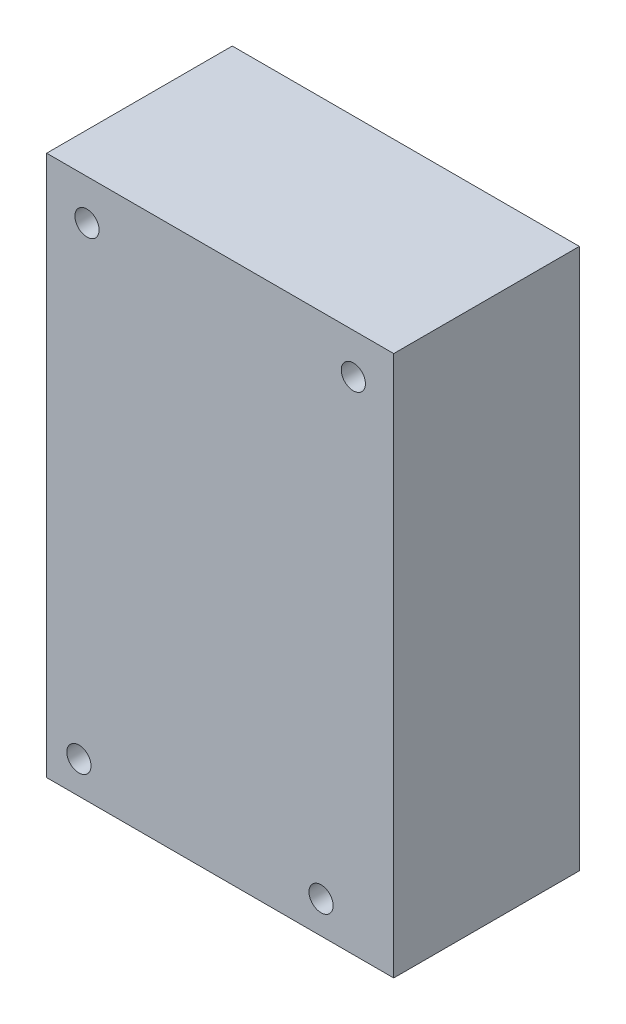
ISO-10303-21;
HEADER;
FILE_DESCRIPTION(('STEP AP214'),'2;1');
FILE_NAME('part.step','',(''),(''),'','','');
FILE_SCHEMA(('AUTOMOTIVE_DESIGN { 1 0 10303 214 1 1 1 1 }'));
ENDSEC;
DATA;
#1=APPLICATION_CONTEXT('core data for automotive mechanical design processes');
#2=APPLICATION_PROTOCOL_DEFINITION('international standard','automotive_design',2000,#1);
#3=PRODUCT_CONTEXT('',#1,'mechanical');
#4=PRODUCT('Part','Part','',(#3));
#5=PRODUCT_RELATED_PRODUCT_CATEGORY('part','',(#4));
#6=PRODUCT_DEFINITION_FORMATION('','',#4);
#7=PRODUCT_DEFINITION_CONTEXT('part definition',#1,'design');
#8=PRODUCT_DEFINITION('design','',#6,#7);
#9=PRODUCT_DEFINITION_SHAPE('','',#8);
#10=(LENGTH_UNIT() NAMED_UNIT(*) SI_UNIT(.MILLI.,.METRE.));
#11=(NAMED_UNIT(*) PLANE_ANGLE_UNIT() SI_UNIT($,.RADIAN.));
#12=(NAMED_UNIT(*) SI_UNIT($,.STERADIAN.) SOLID_ANGLE_UNIT());
#13=UNCERTAINTY_MEASURE_WITH_UNIT(LENGTH_MEASURE(1.E-05),#10,'distance_accuracy_value','');
#14=(GEOMETRIC_REPRESENTATION_CONTEXT(3) GLOBAL_UNCERTAINTY_ASSIGNED_CONTEXT((#13)) GLOBAL_UNIT_ASSIGNED_CONTEXT((#10,
#11,#12)) REPRESENTATION_CONTEXT('',''));
#15=CARTESIAN_POINT('',(0.,0.,0.));
#16=DIRECTION('',(0.,0.,1.));
#17=DIRECTION('',(1.,0.,0.));
#18=AXIS2_PLACEMENT_3D('',#15,#16,#17);
#19=CARTESIAN_POINT('',(21.5,33.5,23.));
#20=DIRECTION('',(0.,-1.,0.));
#21=DIRECTION('',(0.,0.,-1.));
#22=AXIS2_PLACEMENT_3D('',#19,#20,#21);
#23=PLANE('',#22);
#24=DIRECTION('',(-1.,0.,0.));
#25=VECTOR('',#24,1.);
#26=CARTESIAN_POINT('',(21.5,33.5,0.));
#27=LINE('',#26,#25);
#28=CARTESIAN_POINT('',(21.5,33.5,0.));
#29=VERTEX_POINT('',#28);
#30=CARTESIAN_POINT('',(-21.5,33.5,0.));
#31=VERTEX_POINT('',#30);
#32=EDGE_CURVE('E102',#29,#31,#27,.T.);
#33=ORIENTED_EDGE('',*,*,#32,.T.);
#34=DIRECTION('',(0.,0.,-1.));
#35=VECTOR('',#34,1.);
#36=CARTESIAN_POINT('',(-21.5,33.5,23.));
#37=LINE('',#36,#35);
#38=CARTESIAN_POINT('',(-21.5,33.5,23.));
#39=VERTEX_POINT('',#38);
#40=EDGE_CURVE('E11',#39,#31,#37,.T.);
#41=ORIENTED_EDGE('',*,*,#40,.F.);
#42=DIRECTION('',(-1.,0.,0.));
#43=VECTOR('',#42,1.);
#44=CARTESIAN_POINT('',(21.5,33.5,23.));
#45=LINE('',#44,#43);
#46=CARTESIAN_POINT('',(21.5,33.5,23.));
#47=VERTEX_POINT('',#46);
#48=EDGE_CURVE('E90',#47,#39,#45,.T.);
#49=ORIENTED_EDGE('',*,*,#48,.F.);
#50=DIRECTION('',(0.,0.,-1.));
#51=VECTOR('',#50,1.);
#52=CARTESIAN_POINT('',(21.5,33.5,23.));
#53=LINE('',#52,#51);
#54=EDGE_CURVE('E98',#47,#29,#53,.T.);
#55=ORIENTED_EDGE('',*,*,#54,.T.);
#56=EDGE_LOOP('',(#33,#41,#49,#55));
#57=FACE_BOUND('',#56,.T.);
#58=ADVANCED_FACE('F39',(#57),#23,.F.);
#59=CARTESIAN_POINT('',(-21.5,-33.5,23.));
#60=DIRECTION('',(1.,0.,0.));
#61=DIRECTION('',(0.,0.,-1.));
#62=AXIS2_PLACEMENT_3D('',#59,#60,#61);
#63=PLANE('',#62);
#64=DIRECTION('',(0.,-1.,0.));
#65=VECTOR('',#64,1.);
#66=CARTESIAN_POINT('',(-21.5,-33.5,0.));
#67=LINE('',#66,#65);
#68=CARTESIAN_POINT('',(-21.5,-33.5,0.));
#69=VERTEX_POINT('',#68);
#70=EDGE_CURVE('E94',#31,#69,#67,.T.);
#71=ORIENTED_EDGE('',*,*,#70,.T.);
#72=DIRECTION('',(0.,0.,-1.));
#73=VECTOR('',#72,1.);
#74=CARTESIAN_POINT('',(-21.5,-33.5,23.));
#75=LINE('',#74,#73);
#76=CARTESIAN_POINT('',(-21.5,-33.5,23.));
#77=VERTEX_POINT('',#76);
#78=EDGE_CURVE('E47',#77,#69,#75,.T.);
#79=ORIENTED_EDGE('',*,*,#78,.F.);
#80=DIRECTION('',(0.,-1.,0.));
#81=VECTOR('',#80,1.);
#82=CARTESIAN_POINT('',(-21.5,-33.5,23.));
#83=LINE('',#82,#81);
#84=EDGE_CURVE('E85',#39,#77,#83,.T.);
#85=ORIENTED_EDGE('',*,*,#84,.F.);
#86=ORIENTED_EDGE('',*,*,#40,.T.);
#87=EDGE_LOOP('',(#71,#79,#85,#86));
#88=FACE_BOUND('',#87,.T.);
#89=ADVANCED_FACE('F93',(#88),#63,.F.);
#90=CARTESIAN_POINT('',(21.5,-33.5,23.));
#91=DIRECTION('',(0.,1.,0.));
#92=DIRECTION('',(0.,0.,1.));
#93=AXIS2_PLACEMENT_3D('',#90,#91,#92);
#94=PLANE('',#93);
#95=DIRECTION('',(1.,0.,0.));
#96=VECTOR('',#95,1.);
#97=CARTESIAN_POINT('',(21.5,-33.5,0.));
#98=LINE('',#97,#96);
#99=CARTESIAN_POINT('',(21.5,-33.5,0.));
#100=VERTEX_POINT('',#99);
#101=EDGE_CURVE('E72',#69,#100,#98,.T.);
#102=ORIENTED_EDGE('',*,*,#101,.T.);
#103=DIRECTION('',(0.,0.,-1.));
#104=VECTOR('',#103,1.);
#105=CARTESIAN_POINT('',(21.5,-33.5,23.));
#106=LINE('',#105,#104);
#107=CARTESIAN_POINT('',(21.5,-33.5,23.));
#108=VERTEX_POINT('',#107);
#109=EDGE_CURVE('E95',#108,#100,#106,.T.);
#110=ORIENTED_EDGE('',*,*,#109,.F.);
#111=DIRECTION('',(1.,0.,0.));
#112=VECTOR('',#111,1.);
#113=CARTESIAN_POINT('',(21.5,-33.5,23.));
#114=LINE('',#113,#112);
#115=EDGE_CURVE('E88',#77,#108,#114,.T.);
#116=ORIENTED_EDGE('',*,*,#115,.F.);
#117=ORIENTED_EDGE('',*,*,#78,.T.);
#118=EDGE_LOOP('',(#102,#110,#116,#117));
#119=FACE_BOUND('',#118,.T.);
#120=ADVANCED_FACE('F96',(#119),#94,.F.);
#121=CARTESIAN_POINT('',(21.5,-33.5,23.));
#122=DIRECTION('',(-1.,0.,0.));
#123=DIRECTION('',(0.,0.,1.));
#124=AXIS2_PLACEMENT_3D('',#121,#122,#123);
#125=PLANE('',#124);
#126=DIRECTION('',(0.,1.,0.));
#127=VECTOR('',#126,1.);
#128=CARTESIAN_POINT('',(21.5,-33.5,0.));
#129=LINE('',#128,#127);
#130=EDGE_CURVE('E78',#100,#29,#129,.T.);
#131=ORIENTED_EDGE('',*,*,#130,.T.);
#132=ORIENTED_EDGE('',*,*,#54,.F.);
#133=DIRECTION('',(0.,1.,0.));
#134=VECTOR('',#133,1.);
#135=CARTESIAN_POINT('',(21.5,-33.5,23.));
#136=LINE('',#135,#134);
#137=EDGE_CURVE('E55',#108,#47,#136,.T.);
#138=ORIENTED_EDGE('',*,*,#137,.F.);
#139=ORIENTED_EDGE('',*,*,#109,.T.);
#140=EDGE_LOOP('',(#131,#132,#138,#139));
#141=FACE_BOUND('',#140,.T.);
#142=ADVANCED_FACE('F110',(#141),#125,.F.);
#143=CARTESIAN_POINT('',(0.,0.,23.));
#144=DIRECTION('',(0.,0.,-1.));
#145=DIRECTION('',(-1.,0.,0.));
#146=AXIS2_PLACEMENT_3D('',#143,#144,#145);
#147=PLANE('',#146);
#148=CARTESIAN_POINT('',(-17.5,-29.5,23.));
#149=DIRECTION('',(0.,0.,1.));
#150=DIRECTION('',(1.,0.,0.));
#151=AXIS2_PLACEMENT_3D('',#148,#149,#150);
#152=CIRCLE('',#151,1.5);
#153=CARTESIAN_POINT('',(-16.,-29.5,23.));
#154=VERTEX_POINT('',#153);
#155=EDGE_CURVE('E122',#154,#154,#152,.T.);
#156=ORIENTED_EDGE('',*,*,#155,.F.);
#157=EDGE_LOOP('',(#156));
#158=FACE_BOUND('',#157,.T.);
#159=CARTESIAN_POINT('',(12.5,-29.5,23.));
#160=DIRECTION('',(0.,0.,1.));
#161=DIRECTION('',(1.,0.,0.));
#162=AXIS2_PLACEMENT_3D('',#159,#160,#161);
#163=CIRCLE('',#162,1.5);
#164=CARTESIAN_POINT('',(14.,-29.5,23.));
#165=VERTEX_POINT('',#164);
#166=EDGE_CURVE('E128',#165,#165,#163,.T.);
#167=ORIENTED_EDGE('',*,*,#166,.F.);
#168=EDGE_LOOP('',(#167));
#169=FACE_BOUND('',#168,.T.);
#170=CARTESIAN_POINT('',(16.5,28.5,23.));
#171=DIRECTION('',(0.,0.,1.));
#172=DIRECTION('',(1.,0.,0.));
#173=AXIS2_PLACEMENT_3D('',#170,#171,#172);
#174=CIRCLE('',#173,1.5);
#175=CARTESIAN_POINT('',(18.,28.5,23.));
#176=VERTEX_POINT('',#175);
#177=EDGE_CURVE('E134',#176,#176,#174,.T.);
#178=ORIENTED_EDGE('',*,*,#177,.F.);
#179=EDGE_LOOP('',(#178));
#180=FACE_BOUND('',#179,.T.);
#181=CARTESIAN_POINT('',(-16.5,28.5,23.));
#182=DIRECTION('',(0.,0.,1.));
#183=DIRECTION('',(1.,0.,0.));
#184=AXIS2_PLACEMENT_3D('',#181,#182,#183);
#185=CIRCLE('',#184,1.5);
#186=CARTESIAN_POINT('',(-15.,28.5,23.));
#187=VERTEX_POINT('',#186);
#188=EDGE_CURVE('E105',#187,#187,#185,.T.);
#189=ORIENTED_EDGE('',*,*,#188,.F.);
#190=EDGE_LOOP('',(#189));
#191=FACE_BOUND('',#190,.T.);
#192=ORIENTED_EDGE('',*,*,#48,.T.);
#193=ORIENTED_EDGE('',*,*,#84,.T.);
#194=ORIENTED_EDGE('',*,*,#115,.T.);
#195=ORIENTED_EDGE('',*,*,#137,.T.);
#196=EDGE_LOOP('',(#192,#193,#194,#195));
#197=FACE_BOUND('',#196,.T.);
#198=ADVANCED_FACE('F86',(#158,#169,#180,#191,#197),#147,.F.);
#199=CARTESIAN_POINT('',(0.,0.,0.));
#200=DIRECTION('',(0.,0.,-1.));
#201=DIRECTION('',(-1.,0.,0.));
#202=AXIS2_PLACEMENT_3D('',#199,#200,#201);
#203=PLANE('',#202);
#204=CARTESIAN_POINT('',(-17.5,-29.5,0.));
#205=DIRECTION('',(0.,0.,-1.));
#206=DIRECTION('',(-1.,0.,0.));
#207=AXIS2_PLACEMENT_3D('',#204,#205,#206);
#208=CIRCLE('',#207,1.5);
#209=CARTESIAN_POINT('',(-19.,-29.5,0.));
#210=VERTEX_POINT('',#209);
#211=EDGE_CURVE('E125',#210,#210,#208,.F.);
#212=ORIENTED_EDGE('',*,*,#211,.T.);
#213=EDGE_LOOP('',(#212));
#214=FACE_BOUND('',#213,.T.);
#215=CARTESIAN_POINT('',(12.5,-29.5,0.));
#216=DIRECTION('',(0.,0.,-1.));
#217=DIRECTION('',(-1.,0.,0.));
#218=AXIS2_PLACEMENT_3D('',#215,#216,#217);
#219=CIRCLE('',#218,1.5);
#220=CARTESIAN_POINT('',(11.,-29.5,0.));
#221=VERTEX_POINT('',#220);
#222=EDGE_CURVE('E131',#221,#221,#219,.F.);
#223=ORIENTED_EDGE('',*,*,#222,.T.);
#224=EDGE_LOOP('',(#223));
#225=FACE_BOUND('',#224,.T.);
#226=CARTESIAN_POINT('',(16.5,28.5,0.));
#227=DIRECTION('',(0.,0.,-1.));
#228=DIRECTION('',(-1.,0.,0.));
#229=AXIS2_PLACEMENT_3D('',#226,#227,#228);
#230=CIRCLE('',#229,1.5);
#231=CARTESIAN_POINT('',(15.,28.5,0.));
#232=VERTEX_POINT('',#231);
#233=EDGE_CURVE('E119',#232,#232,#230,.F.);
#234=ORIENTED_EDGE('',*,*,#233,.T.);
#235=EDGE_LOOP('',(#234));
#236=FACE_BOUND('',#235,.T.);
#237=CARTESIAN_POINT('',(-16.5,28.5,0.));
#238=DIRECTION('',(0.,0.,-1.));
#239=DIRECTION('',(-1.,0.,0.));
#240=AXIS2_PLACEMENT_3D('',#237,#238,#239);
#241=CIRCLE('',#240,1.5);
#242=CARTESIAN_POINT('',(-18.,28.5,0.));
#243=VERTEX_POINT('',#242);
#244=EDGE_CURVE('E116',#243,#243,#241,.F.);
#245=ORIENTED_EDGE('',*,*,#244,.T.);
#246=EDGE_LOOP('',(#245));
#247=FACE_BOUND('',#246,.T.);
#248=ORIENTED_EDGE('',*,*,#32,.F.);
#249=ORIENTED_EDGE('',*,*,#130,.F.);
#250=ORIENTED_EDGE('',*,*,#101,.F.);
#251=ORIENTED_EDGE('',*,*,#70,.F.);
#252=EDGE_LOOP('',(#248,#249,#250,#251));
#253=FACE_BOUND('',#252,.T.);
#254=ADVANCED_FACE('F113',(#214,#225,#236,#247,#253),#203,.T.);
#255=CARTESIAN_POINT('',(-16.5,28.5,-0.001000000000001));
#256=DIRECTION('',(0.,0.,1.));
#257=DIRECTION('',(1.,0.,0.));
#258=AXIS2_PLACEMENT_3D('',#255,#256,#257);
#259=CYLINDRICAL_SURFACE('',#258,1.5);
#260=ORIENTED_EDGE('',*,*,#244,.F.);
#261=EDGE_LOOP('',(#260));
#262=FACE_BOUND('',#261,.T.);
#263=ORIENTED_EDGE('',*,*,#188,.T.);
#264=EDGE_LOOP('',(#263));
#265=FACE_BOUND('',#264,.T.);
#266=ADVANCED_FACE('F146',(#262,#265),#259,.F.);
#267=CARTESIAN_POINT('',(16.5,28.5,-0.001000000000001));
#268=DIRECTION('',(0.,0.,1.));
#269=DIRECTION('',(1.,0.,0.));
#270=AXIS2_PLACEMENT_3D('',#267,#268,#269);
#271=CYLINDRICAL_SURFACE('',#270,1.5);
#272=ORIENTED_EDGE('',*,*,#233,.F.);
#273=EDGE_LOOP('',(#272));
#274=FACE_BOUND('',#273,.T.);
#275=ORIENTED_EDGE('',*,*,#177,.T.);
#276=EDGE_LOOP('',(#275));
#277=FACE_BOUND('',#276,.T.);
#278=ADVANCED_FACE('F142',(#274,#277),#271,.F.);
#279=CARTESIAN_POINT('',(12.5,-29.5,-0.001000000000001));
#280=DIRECTION('',(0.,0.,1.));
#281=DIRECTION('',(1.,0.,0.));
#282=AXIS2_PLACEMENT_3D('',#279,#280,#281);
#283=CYLINDRICAL_SURFACE('',#282,1.5);
#284=ORIENTED_EDGE('',*,*,#222,.F.);
#285=EDGE_LOOP('',(#284));
#286=FACE_BOUND('',#285,.T.);
#287=ORIENTED_EDGE('',*,*,#166,.T.);
#288=EDGE_LOOP('',(#287));
#289=FACE_BOUND('',#288,.T.);
#290=ADVANCED_FACE('F145',(#286,#289),#283,.F.);
#291=CARTESIAN_POINT('',(-17.5,-29.5,-0.001000000000001));
#292=DIRECTION('',(0.,0.,1.));
#293=DIRECTION('',(1.,0.,0.));
#294=AXIS2_PLACEMENT_3D('',#291,#292,#293);
#295=CYLINDRICAL_SURFACE('',#294,1.5);
#296=ORIENTED_EDGE('',*,*,#211,.F.);
#297=EDGE_LOOP('',(#296));
#298=FACE_BOUND('',#297,.T.);
#299=ORIENTED_EDGE('',*,*,#155,.T.);
#300=EDGE_LOOP('',(#299));
#301=FACE_BOUND('',#300,.T.);
#302=ADVANCED_FACE('F210',(#298,#301),#295,.F.);
#303=CLOSED_SHELL('',(#58,#89,#120,#142,#198,#254,#266,#278,#290,#302));
#304=MANIFOLD_SOLID_BREP('B2',#303);
#305=ADVANCED_BREP_SHAPE_REPRESENTATION('',(#18,#304),#14);
#306=SHAPE_DEFINITION_REPRESENTATION(#9,#305);
ENDSEC;
END-ISO-10303-21;
